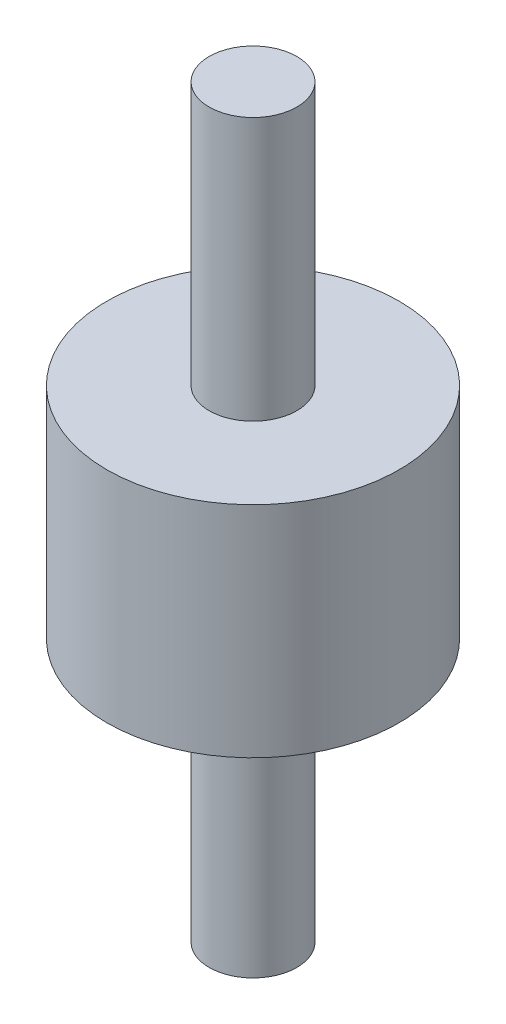
ISO-10303-21;
HEADER;
FILE_DESCRIPTION(('STEP AP214'),'2;1');
FILE_NAME('part.step','',(''),(''),'','','');
FILE_SCHEMA(('AUTOMOTIVE_DESIGN { 1 0 10303 214 1 1 1 1 }'));
ENDSEC;
DATA;
#1=APPLICATION_CONTEXT('core data for automotive mechanical design processes');
#2=APPLICATION_PROTOCOL_DEFINITION('international standard','automotive_design',2000,#1);
#3=PRODUCT_CONTEXT('',#1,'mechanical');
#4=PRODUCT('Part','Part','',(#3));
#5=PRODUCT_RELATED_PRODUCT_CATEGORY('part','',(#4));
#6=PRODUCT_DEFINITION_FORMATION('','',#4);
#7=PRODUCT_DEFINITION_CONTEXT('part definition',#1,'design');
#8=PRODUCT_DEFINITION('design','',#6,#7);
#9=PRODUCT_DEFINITION_SHAPE('','',#8);
#10=(LENGTH_UNIT() NAMED_UNIT(*) SI_UNIT(.MILLI.,.METRE.));
#11=(NAMED_UNIT(*) PLANE_ANGLE_UNIT() SI_UNIT($,.RADIAN.));
#12=(NAMED_UNIT(*) SI_UNIT($,.STERADIAN.) SOLID_ANGLE_UNIT());
#13=UNCERTAINTY_MEASURE_WITH_UNIT(LENGTH_MEASURE(1.E-05),#10,'distance_accuracy_value','');
#14=(GEOMETRIC_REPRESENTATION_CONTEXT(3) GLOBAL_UNCERTAINTY_ASSIGNED_CONTEXT((#13)) GLOBAL_UNIT_ASSIGNED_CONTEXT((#10,
#11,#12)) REPRESENTATION_CONTEXT('',''));
#15=CARTESIAN_POINT('',(0.,0.,0.));
#16=DIRECTION('',(0.,0.,1.));
#17=DIRECTION('',(1.,0.,0.));
#18=AXIS2_PLACEMENT_3D('',#15,#16,#17);
#19=CARTESIAN_POINT('',(0.,51.,0.));
#20=DIRECTION('',(0.,-1.,0.));
#21=DIRECTION('',(0.,0.,-1.));
#22=AXIS2_PLACEMENT_3D('',#19,#20,#21);
#23=PLANE('',#22);
#24=CARTESIAN_POINT('',(0.,51.,0.));
#25=DIRECTION('',(0.,-1.,0.));
#26=DIRECTION('',(0.,0.,-1.));
#27=AXIS2_PLACEMENT_3D('',#24,#25,#26);
#28=CIRCLE('',#27,3.);
#29=CARTESIAN_POINT('',(0.,51.,-3.));
#30=VERTEX_POINT('',#29);
#31=EDGE_CURVE('E10',#30,#30,#28,.T.);
#32=ORIENTED_EDGE('',*,*,#31,.F.);
#33=EDGE_LOOP('',(#32));
#34=FACE_BOUND('',#33,.T.);
#35=ADVANCED_FACE('F34',(#34),#23,.F.);
#36=CARTESIAN_POINT('',(0.,0.,0.));
#37=DIRECTION('',(0.,-1.,0.));
#38=DIRECTION('',(0.,0.,-1.));
#39=AXIS2_PLACEMENT_3D('',#36,#37,#38);
#40=CYLINDRICAL_SURFACE('',#39,3.);
#41=CARTESIAN_POINT('',(0.,33.,0.));
#42=DIRECTION('',(0.,-1.,0.));
#43=DIRECTION('',(0.,0.,-1.));
#44=AXIS2_PLACEMENT_3D('',#41,#42,#43);
#45=CIRCLE('',#44,3.);
#46=CARTESIAN_POINT('',(0.,33.,-3.));
#47=VERTEX_POINT('',#46);
#48=EDGE_CURVE('E40',#47,#47,#45,.T.);
#49=ORIENTED_EDGE('',*,*,#48,.F.);
#50=EDGE_LOOP('',(#49));
#51=FACE_BOUND('',#50,.T.);
#52=ORIENTED_EDGE('',*,*,#31,.T.);
#53=EDGE_LOOP('',(#52));
#54=FACE_BOUND('',#53,.T.);
#55=ADVANCED_FACE('F82',(#51,#54),#40,.T.);
#56=CARTESIAN_POINT('',(-3.,33.,0.));
#57=DIRECTION('',(0.,-1.,0.));
#58=DIRECTION('',(0.,0.,-1.));
#59=AXIS2_PLACEMENT_3D('',#56,#57,#58);
#60=PLANE('',#59);
#61=CARTESIAN_POINT('',(0.,33.,0.));
#62=DIRECTION('',(0.,-1.,0.));
#63=DIRECTION('',(0.,0.,-1.));
#64=AXIS2_PLACEMENT_3D('',#61,#62,#63);
#65=CIRCLE('',#64,10.);
#66=CARTESIAN_POINT('',(0.,33.,-10.));
#67=VERTEX_POINT('',#66);
#68=EDGE_CURVE('E44',#67,#67,#65,.T.);
#69=ORIENTED_EDGE('',*,*,#68,.F.);
#70=EDGE_LOOP('',(#69));
#71=FACE_BOUND('',#70,.T.);
#72=ORIENTED_EDGE('',*,*,#48,.T.);
#73=EDGE_LOOP('',(#72));
#74=FACE_BOUND('',#73,.T.);
#75=ADVANCED_FACE('F77',(#71,#74),#60,.F.);
#76=CARTESIAN_POINT('',(0.,0.,0.));
#77=DIRECTION('',(0.,-1.,0.));
#78=DIRECTION('',(0.,0.,-1.));
#79=AXIS2_PLACEMENT_3D('',#76,#77,#78);
#80=CYLINDRICAL_SURFACE('',#79,10.);
#81=CARTESIAN_POINT('',(0.,18.,0.));
#82=DIRECTION('',(0.,-1.,0.));
#83=DIRECTION('',(0.,0.,-1.));
#84=AXIS2_PLACEMENT_3D('',#81,#82,#83);
#85=CIRCLE('',#84,10.);
#86=CARTESIAN_POINT('',(0.,18.,-10.));
#87=VERTEX_POINT('',#86);
#88=EDGE_CURVE('E48',#87,#87,#85,.T.);
#89=ORIENTED_EDGE('',*,*,#88,.F.);
#90=EDGE_LOOP('',(#89));
#91=FACE_BOUND('',#90,.T.);
#92=ORIENTED_EDGE('',*,*,#68,.T.);
#93=EDGE_LOOP('',(#92));
#94=FACE_BOUND('',#93,.T.);
#95=ADVANCED_FACE('F71',(#91,#94),#80,.T.);
#96=CARTESIAN_POINT('',(-10.,18.,0.));
#97=DIRECTION('',(0.,1.,0.));
#98=DIRECTION('',(0.,0.,1.));
#99=AXIS2_PLACEMENT_3D('',#96,#97,#98);
#100=PLANE('',#99);
#101=CARTESIAN_POINT('',(0.,18.,0.));
#102=DIRECTION('',(0.,-1.,0.));
#103=DIRECTION('',(0.,0.,-1.));
#104=AXIS2_PLACEMENT_3D('',#101,#102,#103);
#105=CIRCLE('',#104,3.);
#106=CARTESIAN_POINT('',(0.,18.,-3.));
#107=VERTEX_POINT('',#106);
#108=EDGE_CURVE('E53',#107,#107,#105,.T.);
#109=ORIENTED_EDGE('',*,*,#108,.F.);
#110=EDGE_LOOP('',(#109));
#111=FACE_BOUND('',#110,.T.);
#112=ORIENTED_EDGE('',*,*,#88,.T.);
#113=EDGE_LOOP('',(#112));
#114=FACE_BOUND('',#113,.T.);
#115=ADVANCED_FACE('F65',(#111,#114),#100,.F.);
#116=CARTESIAN_POINT('',(0.,0.,0.));
#117=DIRECTION('',(0.,-1.,0.));
#118=DIRECTION('',(0.,0.,-1.));
#119=AXIS2_PLACEMENT_3D('',#116,#117,#118);
#120=CYLINDRICAL_SURFACE('',#119,3.);
#121=CARTESIAN_POINT('',(0.,0.,0.));
#122=DIRECTION('',(0.,-1.,0.));
#123=DIRECTION('',(0.,0.,-1.));
#124=AXIS2_PLACEMENT_3D('',#121,#122,#123);
#125=CIRCLE('',#124,3.);
#126=CARTESIAN_POINT('',(0.,0.,-3.));
#127=VERTEX_POINT('',#126);
#128=EDGE_CURVE('E56',#127,#127,#125,.T.);
#129=ORIENTED_EDGE('',*,*,#128,.F.);
#130=EDGE_LOOP('',(#129));
#131=FACE_BOUND('',#130,.T.);
#132=ORIENTED_EDGE('',*,*,#108,.T.);
#133=EDGE_LOOP('',(#132));
#134=FACE_BOUND('',#133,.T.);
#135=ADVANCED_FACE('F62',(#131,#134),#120,.T.);
#136=CARTESIAN_POINT('',(-3.,0.,0.));
#137=DIRECTION('',(0.,1.,0.));
#138=DIRECTION('',(0.,0.,1.));
#139=AXIS2_PLACEMENT_3D('',#136,#137,#138);
#140=PLANE('',#139);
#141=ORIENTED_EDGE('',*,*,#128,.T.);
#142=EDGE_LOOP('',(#141));
#143=FACE_BOUND('',#142,.T.);
#144=ADVANCED_FACE('F60',(#143),#140,.F.);
#145=CLOSED_SHELL('',(#35,#55,#75,#95,#115,#135,#144));
#146=MANIFOLD_SOLID_BREP('B2',#145);
#147=ADVANCED_BREP_SHAPE_REPRESENTATION('',(#18,#146),#14);
#148=SHAPE_DEFINITION_REPRESENTATION(#9,#147);
ENDSEC;
END-ISO-10303-21;
